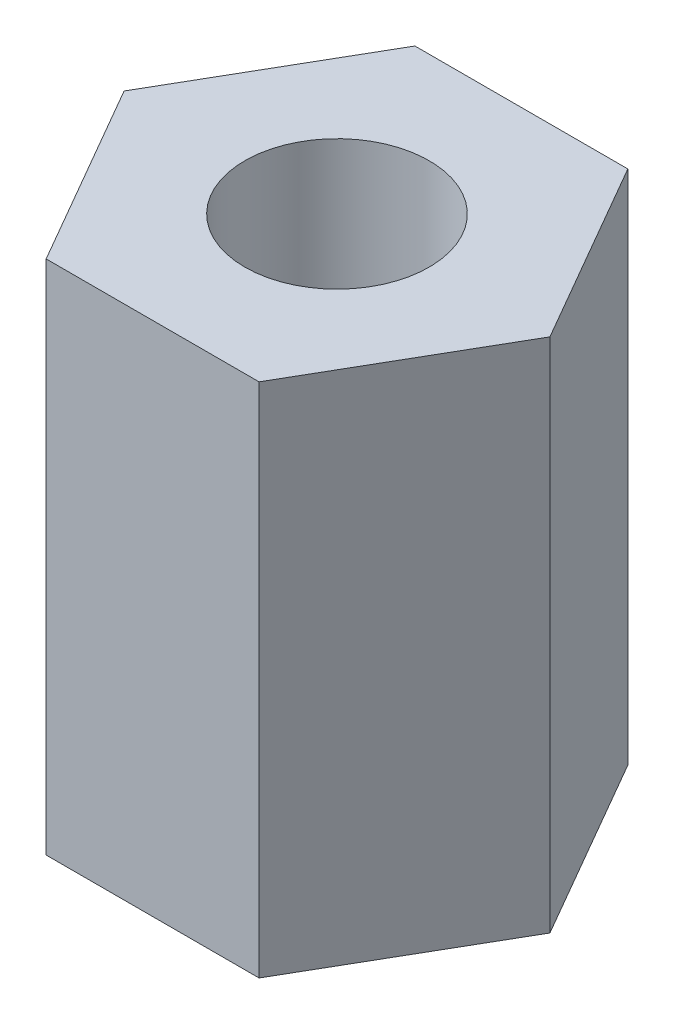
ISO-10303-21;
HEADER;
FILE_DESCRIPTION(('STEP AP214'),'2;1');
FILE_NAME('part.step','',(''),(''),'','','');
FILE_SCHEMA(('AUTOMOTIVE_DESIGN { 1 0 10303 214 1 1 1 1 }'));
ENDSEC;
DATA;
#1=APPLICATION_CONTEXT('core data for automotive mechanical design processes');
#2=APPLICATION_PROTOCOL_DEFINITION('international standard','automotive_design',2000,#1);
#3=PRODUCT_CONTEXT('',#1,'mechanical');
#4=PRODUCT('Part','Part','',(#3));
#5=PRODUCT_RELATED_PRODUCT_CATEGORY('part','',(#4));
#6=PRODUCT_DEFINITION_FORMATION('','',#4);
#7=PRODUCT_DEFINITION_CONTEXT('part definition',#1,'design');
#8=PRODUCT_DEFINITION('design','',#6,#7);
#9=PRODUCT_DEFINITION_SHAPE('','',#8);
#10=(LENGTH_UNIT() NAMED_UNIT(*) SI_UNIT(.MILLI.,.METRE.));
#11=(NAMED_UNIT(*) PLANE_ANGLE_UNIT() SI_UNIT($,.RADIAN.));
#12=(NAMED_UNIT(*) SI_UNIT($,.STERADIAN.) SOLID_ANGLE_UNIT());
#13=UNCERTAINTY_MEASURE_WITH_UNIT(LENGTH_MEASURE(1.E-05),#10,'distance_accuracy_value','');
#14=(GEOMETRIC_REPRESENTATION_CONTEXT(3) GLOBAL_UNCERTAINTY_ASSIGNED_CONTEXT((#13)) GLOBAL_UNIT_ASSIGNED_CONTEXT((#10,
#11,#12)) REPRESENTATION_CONTEXT('',''));
#15=CARTESIAN_POINT('',(0.,0.,0.));
#16=DIRECTION('',(0.,0.,1.));
#17=DIRECTION('',(1.,0.,0.));
#18=AXIS2_PLACEMENT_3D('',#15,#16,#17);
#19=CARTESIAN_POINT('',(-2.88675134592777,7.,4.16996623862909E-11));
#20=DIRECTION('',(-0.866025403784439,0.,-0.5));
#21=DIRECTION('',(-0.5,0.,0.866025403784439));
#22=AXIS2_PLACEMENT_3D('',#19,#20,#21);
#23=PLANE('',#22);
#24=DIRECTION('',(0.5,0.,-0.866025403784439));
#25=VECTOR('',#24,1.);
#26=CARTESIAN_POINT('',(-2.88675134592777,0.,4.16996623862909E-11));
#27=LINE('',#26,#25);
#28=CARTESIAN_POINT('',(-2.88675134592777,0.,4.16996623862909E-11));
#29=VERTEX_POINT('',#28);
#30=CARTESIAN_POINT('',(-1.44337567294723,0.,-2.49999999996953));
#31=VERTEX_POINT('',#30);
#32=EDGE_CURVE('E130',#29,#31,#27,.T.);
#33=ORIENTED_EDGE('',*,*,#32,.F.);
#34=DIRECTION('',(0.,-1.,0.));
#35=VECTOR('',#34,1.);
#36=CARTESIAN_POINT('',(-2.88675134592777,7.,4.16996623862909E-11));
#37=LINE('',#36,#35);
#38=CARTESIAN_POINT('',(-2.88675134592777,7.,4.16996623862909E-11));
#39=VERTEX_POINT('',#38);
#40=EDGE_CURVE('E11',#39,#29,#37,.T.);
#41=ORIENTED_EDGE('',*,*,#40,.F.);
#42=DIRECTION('',(0.5,0.,-0.866025403784439));
#43=VECTOR('',#42,1.);
#44=CARTESIAN_POINT('',(-2.88675134592777,7.,4.16996623862909E-11));
#45=LINE('',#44,#43);
#46=CARTESIAN_POINT('',(-1.44337567294723,7.,-2.49999999996953));
#47=VERTEX_POINT('',#46);
#48=EDGE_CURVE('E151',#39,#47,#45,.T.);
#49=ORIENTED_EDGE('',*,*,#48,.T.);
#50=DIRECTION('',(0.,-1.,0.));
#51=VECTOR('',#50,1.);
#52=CARTESIAN_POINT('',(-1.44337567294723,7.,-2.49999999996953));
#53=LINE('',#52,#51);
#54=EDGE_CURVE('E42',#47,#31,#53,.T.);
#55=ORIENTED_EDGE('',*,*,#54,.T.);
#56=EDGE_LOOP('',(#33,#41,#49,#55));
#57=FACE_BOUND('',#56,.T.);
#58=ADVANCED_FACE('F39',(#57),#23,.T.);
#59=CARTESIAN_POINT('',(-1.44337567298334,7.,2.49999999999038));
#60=DIRECTION('',(-0.866025403784438,0.,0.5));
#61=DIRECTION('',(0.5,0.,0.866025403784439));
#62=AXIS2_PLACEMENT_3D('',#59,#60,#61);
#63=PLANE('',#62);
#64=DIRECTION('',(-0.5,0.,-0.866025403784438));
#65=VECTOR('',#64,1.);
#66=CARTESIAN_POINT('',(-1.44337567298334,0.,2.49999999999038));
#67=LINE('',#66,#65);
#68=CARTESIAN_POINT('',(-1.44337567298334,0.,2.49999999999038));
#69=VERTEX_POINT('',#68);
#70=EDGE_CURVE('E148',#69,#29,#67,.T.);
#71=ORIENTED_EDGE('',*,*,#70,.F.);
#72=DIRECTION('',(0.,-1.,0.));
#73=VECTOR('',#72,1.);
#74=CARTESIAN_POINT('',(-1.44337567298334,7.,2.49999999999038));
#75=LINE('',#74,#73);
#76=CARTESIAN_POINT('',(-1.44337567298334,7.,2.49999999999038));
#77=VERTEX_POINT('',#76);
#78=EDGE_CURVE('E49',#77,#69,#75,.T.);
#79=ORIENTED_EDGE('',*,*,#78,.F.);
#80=DIRECTION('',(-0.5,0.,-0.866025403784438));
#81=VECTOR('',#80,1.);
#82=CARTESIAN_POINT('',(-1.44337567298334,7.,2.49999999999038));
#83=LINE('',#82,#81);
#84=EDGE_CURVE('E116',#77,#39,#83,.T.);
#85=ORIENTED_EDGE('',*,*,#84,.T.);
#86=ORIENTED_EDGE('',*,*,#40,.T.);
#87=EDGE_LOOP('',(#71,#79,#85,#86));
#88=FACE_BOUND('',#87,.T.);
#89=ADVANCED_FACE('F163',(#88),#63,.T.);
#90=CARTESIAN_POINT('',(1.44337567308889,7.,2.49999999999038));
#91=DIRECTION('',(0.,0.,1.));
#92=DIRECTION('',(1.,0.,0.));
#93=AXIS2_PLACEMENT_3D('',#90,#91,#92);
#94=PLANE('',#93);
#95=DIRECTION('',(-1.,0.,0.));
#96=VECTOR('',#95,1.);
#97=CARTESIAN_POINT('',(1.44337567308889,0.,2.49999999999038));
#98=LINE('',#97,#96);
#99=CARTESIAN_POINT('',(1.44337567308889,0.,2.49999999999038));
#100=VERTEX_POINT('',#99);
#101=EDGE_CURVE('E102',#100,#69,#98,.T.);
#102=ORIENTED_EDGE('',*,*,#101,.F.);
#103=DIRECTION('',(0.,-1.,0.));
#104=VECTOR('',#103,1.);
#105=CARTESIAN_POINT('',(1.44337567308889,7.,2.49999999999038));
#106=LINE('',#105,#104);
#107=CARTESIAN_POINT('',(1.44337567308889,7.,2.49999999999038));
#108=VERTEX_POINT('',#107);
#109=EDGE_CURVE('E97',#108,#100,#106,.T.);
#110=ORIENTED_EDGE('',*,*,#109,.F.);
#111=DIRECTION('',(-1.,0.,0.));
#112=VECTOR('',#111,1.);
#113=CARTESIAN_POINT('',(1.44337567308889,7.,2.49999999999038));
#114=LINE('',#113,#112);
#115=EDGE_CURVE('E100',#108,#77,#114,.T.);
#116=ORIENTED_EDGE('',*,*,#115,.T.);
#117=ORIENTED_EDGE('',*,*,#78,.T.);
#118=EDGE_LOOP('',(#102,#110,#116,#117));
#119=FACE_BOUND('',#118,.T.);
#120=ADVANCED_FACE('F99',(#119),#94,.T.);
#121=CARTESIAN_POINT('',(2.88675134603332,7.,-8.33997042433421E-11));
#122=DIRECTION('',(0.866025403795273,0.,0.499999999981235));
#123=DIRECTION('',(0.499999999981235,0.,-0.866025403795273));
#124=AXIS2_PLACEMENT_3D('',#121,#122,#123);
#125=PLANE('',#124);
#126=DIRECTION('',(-0.499999999981235,0.,0.866025403795273));
#127=VECTOR('',#126,1.);
#128=CARTESIAN_POINT('',(2.88675134603332,0.,-8.33997042433421E-11));
#129=LINE('',#128,#127);
#130=CARTESIAN_POINT('',(2.88675134603332,0.,-8.33997042433421E-11));
#131=VERTEX_POINT('',#130);
#132=EDGE_CURVE('E143',#131,#100,#129,.T.);
#133=ORIENTED_EDGE('',*,*,#132,.F.);
#134=DIRECTION('',(0.,-1.,0.));
#135=VECTOR('',#134,1.);
#136=CARTESIAN_POINT('',(2.88675134603332,7.,-8.33997042433421E-11));
#137=LINE('',#136,#135);
#138=CARTESIAN_POINT('',(2.88675134603332,7.,-8.33997042433421E-11));
#139=VERTEX_POINT('',#138);
#140=EDGE_CURVE('E108',#139,#131,#137,.T.);
#141=ORIENTED_EDGE('',*,*,#140,.F.);
#142=DIRECTION('',(-0.499999999981235,0.,0.866025403795273));
#143=VECTOR('',#142,1.);
#144=CARTESIAN_POINT('',(2.88675134603332,7.,-8.33997042433421E-11));
#145=LINE('',#144,#143);
#146=EDGE_CURVE('E114',#139,#108,#145,.T.);
#147=ORIENTED_EDGE('',*,*,#146,.T.);
#148=ORIENTED_EDGE('',*,*,#109,.T.);
#149=EDGE_LOOP('',(#133,#141,#147,#148));
#150=FACE_BOUND('',#149,.T.);
#151=ADVANCED_FACE('F119',(#150),#125,.T.);
#152=CARTESIAN_POINT('',(1.443375673125,7.,-2.49999999996953));
#153=DIRECTION('',(0.866025403784439,0.,-0.5));
#154=DIRECTION('',(-0.5,0.,-0.866025403784439));
#155=AXIS2_PLACEMENT_3D('',#152,#153,#154);
#156=PLANE('',#155);
#157=DIRECTION('',(0.5,0.,0.866025403784439));
#158=VECTOR('',#157,1.);
#159=CARTESIAN_POINT('',(1.443375673125,0.,-2.49999999996953));
#160=LINE('',#159,#158);
#161=CARTESIAN_POINT('',(1.443375673125,0.,-2.49999999996953));
#162=VERTEX_POINT('',#161);
#163=EDGE_CURVE('E139',#162,#131,#160,.T.);
#164=ORIENTED_EDGE('',*,*,#163,.F.);
#165=DIRECTION('',(0.,-1.,0.));
#166=VECTOR('',#165,1.);
#167=CARTESIAN_POINT('',(1.443375673125,7.,-2.49999999996953));
#168=LINE('',#167,#166);
#169=CARTESIAN_POINT('',(1.443375673125,7.,-2.49999999996953));
#170=VERTEX_POINT('',#169);
#171=EDGE_CURVE('E156',#170,#162,#168,.T.);
#172=ORIENTED_EDGE('',*,*,#171,.F.);
#173=DIRECTION('',(0.5,0.,0.866025403784439));
#174=VECTOR('',#173,1.);
#175=CARTESIAN_POINT('',(1.443375673125,7.,-2.49999999996953));
#176=LINE('',#175,#174);
#177=EDGE_CURVE('E121',#170,#139,#176,.T.);
#178=ORIENTED_EDGE('',*,*,#177,.T.);
#179=ORIENTED_EDGE('',*,*,#140,.T.);
#180=EDGE_LOOP('',(#164,#172,#178,#179));
#181=FACE_BOUND('',#180,.T.);
#182=ADVANCED_FACE('F176',(#181),#156,.T.);
#183=CARTESIAN_POINT('',(-1.44337567294723,7.,-2.49999999996953));
#184=DIRECTION('',(0.,0.,-1.));
#185=DIRECTION('',(-1.,0.,0.));
#186=AXIS2_PLACEMENT_3D('',#183,#184,#185);
#187=PLANE('',#186);
#188=DIRECTION('',(1.,0.,0.));
#189=VECTOR('',#188,1.);
#190=CARTESIAN_POINT('',(-1.44337567294723,0.,-2.49999999996953));
#191=LINE('',#190,#189);
#192=EDGE_CURVE('E134',#31,#162,#191,.T.);
#193=ORIENTED_EDGE('',*,*,#192,.F.);
#194=ORIENTED_EDGE('',*,*,#54,.F.);
#195=DIRECTION('',(1.,0.,0.));
#196=VECTOR('',#195,1.);
#197=CARTESIAN_POINT('',(-1.44337567294723,7.,-2.49999999996953));
#198=LINE('',#197,#196);
#199=EDGE_CURVE('E124',#47,#170,#198,.T.);
#200=ORIENTED_EDGE('',*,*,#199,.T.);
#201=ORIENTED_EDGE('',*,*,#171,.T.);
#202=EDGE_LOOP('',(#193,#194,#200,#201));
#203=FACE_BOUND('',#202,.T.);
#204=ADVANCED_FACE('F160',(#203),#187,.T.);
#205=CARTESIAN_POINT('',(0.,7.,0.));
#206=DIRECTION('',(0.,-1.,0.));
#207=DIRECTION('',(0.,0.,-1.));
#208=AXIS2_PLACEMENT_3D('',#205,#206,#207);
#209=PLANE('',#208);
#210=CARTESIAN_POINT('',(0.,7.,0.));
#211=DIRECTION('',(0.,-1.,0.));
#212=DIRECTION('',(0.,0.,1.));
#213=AXIS2_PLACEMENT_3D('',#210,#211,#212);
#214=CIRCLE('',#213,1.25);
#215=CARTESIAN_POINT('',(0.,7.,1.25));
#216=VERTEX_POINT('',#215);
#217=EDGE_CURVE('E135',#216,#216,#214,.T.);
#218=ORIENTED_EDGE('',*,*,#217,.T.);
#219=EDGE_LOOP('',(#218));
#220=FACE_BOUND('',#219,.T.);
#221=ORIENTED_EDGE('',*,*,#48,.F.);
#222=ORIENTED_EDGE('',*,*,#84,.F.);
#223=ORIENTED_EDGE('',*,*,#115,.F.);
#224=ORIENTED_EDGE('',*,*,#146,.F.);
#225=ORIENTED_EDGE('',*,*,#177,.F.);
#226=ORIENTED_EDGE('',*,*,#199,.F.);
#227=EDGE_LOOP('',(#221,#222,#223,#224,#225,#226));
#228=FACE_BOUND('',#227,.T.);
#229=ADVANCED_FACE('F112',(#220,#228),#209,.F.);
#230=CARTESIAN_POINT('',(0.,0.,0.));
#231=DIRECTION('',(0.,-1.,0.));
#232=DIRECTION('',(0.,0.,-1.));
#233=AXIS2_PLACEMENT_3D('',#230,#231,#232);
#234=PLANE('',#233);
#235=CARTESIAN_POINT('',(0.,0.,0.));
#236=DIRECTION('',(0.,-1.,0.));
#237=DIRECTION('',(0.,0.,1.));
#238=AXIS2_PLACEMENT_3D('',#235,#236,#237);
#239=CIRCLE('',#238,1.25);
#240=CARTESIAN_POINT('',(0.,0.,1.25));
#241=VERTEX_POINT('',#240);
#242=EDGE_CURVE('E199',#241,#241,#239,.T.);
#243=ORIENTED_EDGE('',*,*,#242,.F.);
#244=EDGE_LOOP('',(#243));
#245=FACE_BOUND('',#244,.T.);
#246=ORIENTED_EDGE('',*,*,#32,.T.);
#247=ORIENTED_EDGE('',*,*,#192,.T.);
#248=ORIENTED_EDGE('',*,*,#163,.T.);
#249=ORIENTED_EDGE('',*,*,#132,.T.);
#250=ORIENTED_EDGE('',*,*,#101,.T.);
#251=ORIENTED_EDGE('',*,*,#70,.T.);
#252=EDGE_LOOP('',(#246,#247,#248,#249,#250,#251));
#253=FACE_BOUND('',#252,.T.);
#254=ADVANCED_FACE('F162',(#245,#253),#234,.T.);
#255=CARTESIAN_POINT('',(0.,7.,0.));
#256=DIRECTION('',(0.,-1.,0.));
#257=DIRECTION('',(0.,0.,-1.));
#258=AXIS2_PLACEMENT_3D('',#255,#256,#257);
#259=CYLINDRICAL_SURFACE('',#258,1.25);
#260=ORIENTED_EDGE('',*,*,#217,.F.);
#261=EDGE_LOOP('',(#260));
#262=FACE_BOUND('',#261,.T.);
#263=ORIENTED_EDGE('',*,*,#242,.T.);
#264=EDGE_LOOP('',(#263));
#265=FACE_BOUND('',#264,.T.);
#266=ADVANCED_FACE('F187',(#262,#265),#259,.F.);
#267=CLOSED_SHELL('',(#58,#89,#120,#151,#182,#204,#229,#254,#266));
#268=MANIFOLD_SOLID_BREP('B2',#267);
#269=ADVANCED_BREP_SHAPE_REPRESENTATION('',(#18,#268),#14);
#270=SHAPE_DEFINITION_REPRESENTATION(#9,#269);
ENDSEC;
END-ISO-10303-21;
